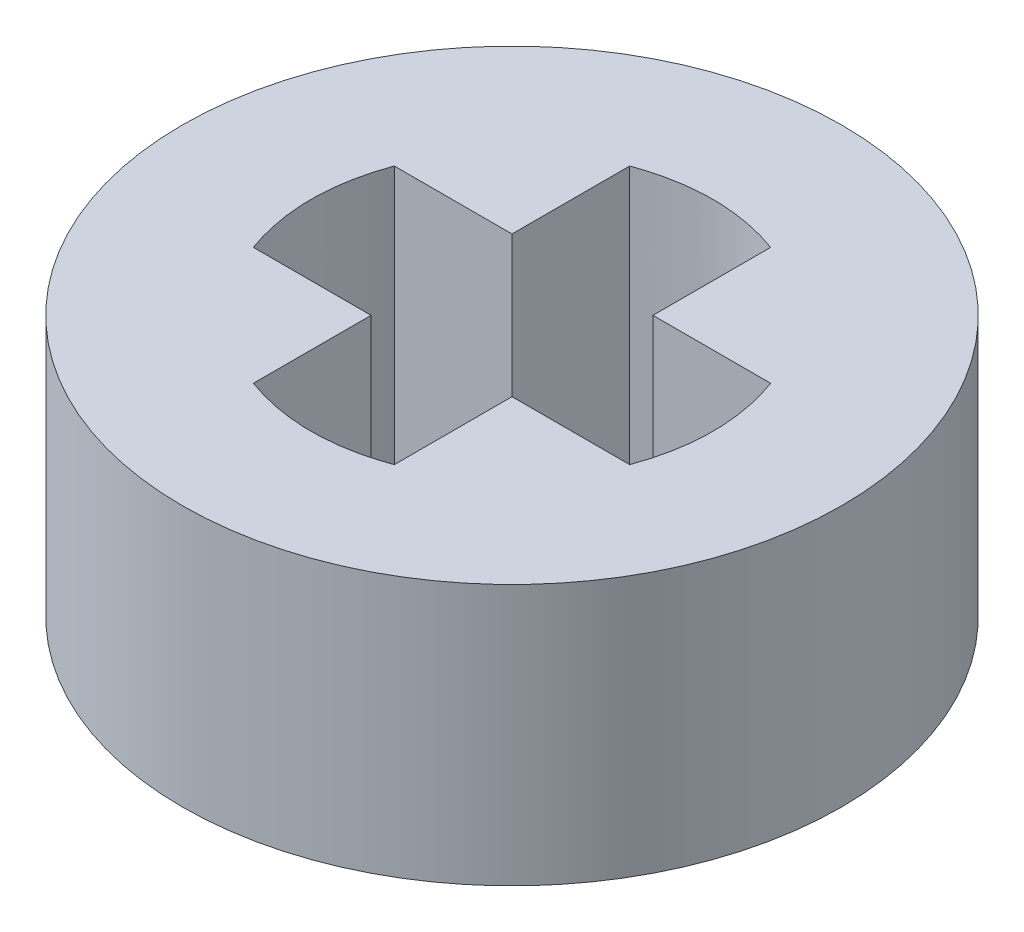
ISO-10303-21;
HEADER;
FILE_DESCRIPTION(('STEP AP214'),'2;1');
FILE_NAME('part.step','',(''),(''),'','','');
FILE_SCHEMA(('AUTOMOTIVE_DESIGN { 1 0 10303 214 1 1 1 1 }'));
ENDSEC;
DATA;
#1=APPLICATION_CONTEXT('core data for automotive mechanical design processes');
#2=APPLICATION_PROTOCOL_DEFINITION('international standard','automotive_design',2000,#1);
#3=PRODUCT_CONTEXT('',#1,'mechanical');
#4=PRODUCT('Part','Part','',(#3));
#5=PRODUCT_RELATED_PRODUCT_CATEGORY('part','',(#4));
#6=PRODUCT_DEFINITION_FORMATION('','',#4);
#7=PRODUCT_DEFINITION_CONTEXT('part definition',#1,'design');
#8=PRODUCT_DEFINITION('design','',#6,#7);
#9=PRODUCT_DEFINITION_SHAPE('','',#8);
#10=(LENGTH_UNIT() NAMED_UNIT(*) SI_UNIT(.MILLI.,.METRE.));
#11=(NAMED_UNIT(*) PLANE_ANGLE_UNIT() SI_UNIT($,.RADIAN.));
#12=(NAMED_UNIT(*) SI_UNIT($,.STERADIAN.) SOLID_ANGLE_UNIT());
#13=UNCERTAINTY_MEASURE_WITH_UNIT(LENGTH_MEASURE(1.E-05),#10,'distance_accuracy_value','');
#14=(GEOMETRIC_REPRESENTATION_CONTEXT(3) GLOBAL_UNCERTAINTY_ASSIGNED_CONTEXT((#13)) GLOBAL_UNIT_ASSIGNED_CONTEXT((#10,
#11,#12)) REPRESENTATION_CONTEXT('',''));
#15=CARTESIAN_POINT('',(0.,0.,0.));
#16=DIRECTION('',(0.,0.,1.));
#17=DIRECTION('',(1.,0.,0.));
#18=AXIS2_PLACEMENT_3D('',#15,#16,#17);
#19=CARTESIAN_POINT('',(0.,3.,0.));
#20=DIRECTION('',(0.,-1.,0.));
#21=DIRECTION('',(0.,0.,-1.));
#22=AXIS2_PLACEMENT_3D('',#19,#20,#21);
#23=CYLINDRICAL_SURFACE('',#22,3.79);
#24=CARTESIAN_POINT('',(0.,3.,0.));
#25=DIRECTION('',(0.,1.,0.));
#26=DIRECTION('',(0.,0.,1.));
#27=AXIS2_PLACEMENT_3D('',#24,#25,#26);
#28=CIRCLE('',#27,3.79);
#29=CARTESIAN_POINT('',(0.,3.,3.79));
#30=VERTEX_POINT('',#29);
#31=EDGE_CURVE('E12',#30,#30,#28,.T.);
#32=ORIENTED_EDGE('',*,*,#31,.F.);
#33=EDGE_LOOP('',(#32));
#34=FACE_BOUND('',#33,.T.);
#35=CARTESIAN_POINT('',(0.,0.,0.));
#36=DIRECTION('',(0.,1.,0.));
#37=DIRECTION('',(0.,0.,1.));
#38=AXIS2_PLACEMENT_3D('',#35,#36,#37);
#39=CIRCLE('',#38,3.79);
#40=CARTESIAN_POINT('',(0.,0.,3.79));
#41=VERTEX_POINT('',#40);
#42=EDGE_CURVE('E41',#41,#41,#39,.T.);
#43=ORIENTED_EDGE('',*,*,#42,.T.);
#44=EDGE_LOOP('',(#43));
#45=FACE_BOUND('',#44,.T.);
#46=ADVANCED_FACE('F38',(#34,#45),#23,.T.);
#47=CARTESIAN_POINT('',(0.,3.,0.));
#48=DIRECTION('',(0.,1.,0.));
#49=DIRECTION('',(0.,0.,1.));
#50=AXIS2_PLACEMENT_3D('',#47,#48,#49);
#51=PLANE('',#50);
#52=CARTESIAN_POINT('',(-2.16333076527839,3.,-0.81));
#53=CARTESIAN_POINT('',(-2.45666923472161,3.,0.));
#54=CARTESIAN_POINT('',(-2.16333076527839,3.,0.81));
#55=B_SPLINE_CURVE_WITH_KNOTS('',2,(#52,#53,#54),.UNSPECIFIED.,.F.,.F.,(3,3),(0.,1.),.UNSPECIFIED.);
#56=CARTESIAN_POINT('',(-2.16333076527839,3.,-0.81));
#57=VERTEX_POINT('',#56);
#58=CARTESIAN_POINT('',(-2.16333076527839,3.,0.81));
#59=VERTEX_POINT('',#58);
#60=EDGE_CURVE('E52',#57,#59,#55,.T.);
#61=ORIENTED_EDGE('',*,*,#60,.F.);
#62=DIRECTION('',(-1.,0.,0.));
#63=VECTOR('',#62,1.);
#64=CARTESIAN_POINT('',(-2.16333076527839,3.,-0.81));
#65=LINE('',#64,#63);
#66=CARTESIAN_POINT('',(-0.81,3.,-0.81));
#67=VERTEX_POINT('',#66);
#68=EDGE_CURVE('E145',#67,#57,#65,.T.);
#69=ORIENTED_EDGE('',*,*,#68,.F.);
#70=DIRECTION('',(0.,0.,1.));
#71=VECTOR('',#70,1.);
#72=CARTESIAN_POINT('',(-0.81,3.,-0.81));
#73=LINE('',#72,#71);
#74=CARTESIAN_POINT('',(-0.81,3.,-2.16333076527839));
#75=VERTEX_POINT('',#74);
#76=EDGE_CURVE('E149',#75,#67,#73,.T.);
#77=ORIENTED_EDGE('',*,*,#76,.F.);
#78=CARTESIAN_POINT('',(0.81,3.,-2.16333076527839));
#79=CARTESIAN_POINT('',(0.,3.,-2.45666923472161));
#80=CARTESIAN_POINT('',(-0.81,3.,-2.16333076527839));
#81=B_SPLINE_CURVE_WITH_KNOTS('',2,(#78,#79,#80),.UNSPECIFIED.,.F.,.F.,(3,3),(0.,1.),.UNSPECIFIED.);
#82=CARTESIAN_POINT('',(0.81,3.,-2.16333076527839));
#83=VERTEX_POINT('',#82);
#84=EDGE_CURVE('E262',#83,#75,#81,.T.);
#85=ORIENTED_EDGE('',*,*,#84,.F.);
#86=DIRECTION('',(0.,0.,-1.));
#87=VECTOR('',#86,1.);
#88=CARTESIAN_POINT('',(0.81,3.,-2.16333076527839));
#89=LINE('',#88,#87);
#90=CARTESIAN_POINT('',(0.81,3.,-0.81));
#91=VERTEX_POINT('',#90);
#92=EDGE_CURVE('E258',#91,#83,#89,.T.);
#93=ORIENTED_EDGE('',*,*,#92,.F.);
#94=DIRECTION('',(-1.,0.,0.));
#95=VECTOR('',#94,1.);
#96=CARTESIAN_POINT('',(0.81,3.,-0.81));
#97=LINE('',#96,#95);
#98=CARTESIAN_POINT('',(2.16333076527839,3.,-0.81));
#99=VERTEX_POINT('',#98);
#100=EDGE_CURVE('E247',#99,#91,#97,.T.);
#101=ORIENTED_EDGE('',*,*,#100,.F.);
#102=CARTESIAN_POINT('',(2.16333076527839,3.,0.81));
#103=CARTESIAN_POINT('',(2.45666923472161,3.,0.));
#104=CARTESIAN_POINT('',(2.16333076527839,3.,-0.81));
#105=B_SPLINE_CURVE_WITH_KNOTS('',2,(#102,#103,#104),.UNSPECIFIED.,.F.,.F.,(3,3),(0.,1.),.UNSPECIFIED.);
#106=CARTESIAN_POINT('',(2.16333076527839,3.,0.81));
#107=VERTEX_POINT('',#106);
#108=EDGE_CURVE('E240',#107,#99,#105,.T.);
#109=ORIENTED_EDGE('',*,*,#108,.F.);
#110=DIRECTION('',(1.,0.,0.));
#111=VECTOR('',#110,1.);
#112=CARTESIAN_POINT('',(2.16333076527839,3.,0.81));
#113=LINE('',#112,#111);
#114=CARTESIAN_POINT('',(0.81,3.,0.81));
#115=VERTEX_POINT('',#114);
#116=EDGE_CURVE('E235',#115,#107,#113,.T.);
#117=ORIENTED_EDGE('',*,*,#116,.F.);
#118=DIRECTION('',(0.,0.,-1.));
#119=VECTOR('',#118,1.);
#120=CARTESIAN_POINT('',(0.81,3.,0.81));
#121=LINE('',#120,#119);
#122=CARTESIAN_POINT('',(0.81,3.,2.16333076527839));
#123=VERTEX_POINT('',#122);
#124=EDGE_CURVE('E217',#123,#115,#121,.T.);
#125=ORIENTED_EDGE('',*,*,#124,.F.);
#126=CARTESIAN_POINT('',(-0.81,3.,2.16333076527839));
#127=CARTESIAN_POINT('',(0.,3.,2.45666923472161));
#128=CARTESIAN_POINT('',(0.81,3.,2.16333076527839));
#129=B_SPLINE_CURVE_WITH_KNOTS('',2,(#126,#127,#128),.UNSPECIFIED.,.F.,.F.,(3,3),(0.,1.),.UNSPECIFIED.);
#130=CARTESIAN_POINT('',(-0.81,3.,2.16333076527839));
#131=VERTEX_POINT('',#130);
#132=EDGE_CURVE('E213',#131,#123,#129,.T.);
#133=ORIENTED_EDGE('',*,*,#132,.F.);
#134=DIRECTION('',(0.,0.,1.));
#135=VECTOR('',#134,1.);
#136=CARTESIAN_POINT('',(-0.81,3.,2.16333076527839));
#137=LINE('',#136,#135);
#138=CARTESIAN_POINT('',(-0.81,3.,0.81));
#139=VERTEX_POINT('',#138);
#140=EDGE_CURVE('E205',#139,#131,#137,.T.);
#141=ORIENTED_EDGE('',*,*,#140,.F.);
#142=DIRECTION('',(1.,0.,0.));
#143=VECTOR('',#142,1.);
#144=CARTESIAN_POINT('',(-0.81,3.,0.81));
#145=LINE('',#144,#143);
#146=EDGE_CURVE('E207',#59,#139,#145,.T.);
#147=ORIENTED_EDGE('',*,*,#146,.F.);
#148=EDGE_LOOP('',(#61,#69,#77,#85,#93,#101,#109,#117,#125,#133,#141,#147));
#149=FACE_BOUND('',#148,.T.);
#150=ORIENTED_EDGE('',*,*,#31,.T.);
#151=EDGE_LOOP('',(#150));
#152=FACE_BOUND('',#151,.T.);
#153=ADVANCED_FACE('F164',(#149,#152),#51,.T.);
#154=CARTESIAN_POINT('',(0.,0.,0.));
#155=DIRECTION('',(0.,1.,0.));
#156=DIRECTION('',(0.,0.,1.));
#157=AXIS2_PLACEMENT_3D('',#154,#155,#156);
#158=PLANE('',#157);
#159=DIRECTION('',(-1.,0.,0.));
#160=VECTOR('',#159,1.);
#161=CARTESIAN_POINT('',(-2.16333076527839,0.,-0.81));
#162=LINE('',#161,#160);
#163=CARTESIAN_POINT('',(-0.81,0.,-0.81));
#164=VERTEX_POINT('',#163);
#165=CARTESIAN_POINT('',(-2.16333076527839,0.,-0.81));
#166=VERTEX_POINT('',#165);
#167=EDGE_CURVE('E134',#164,#166,#162,.T.);
#168=ORIENTED_EDGE('',*,*,#167,.T.);
#169=CARTESIAN_POINT('',(-2.16333076527839,0.,-0.81));
#170=CARTESIAN_POINT('',(-2.45666923472161,0.,0.));
#171=CARTESIAN_POINT('',(-2.16333076527839,0.,0.81));
#172=B_SPLINE_CURVE_WITH_KNOTS('',2,(#169,#170,#171),.UNSPECIFIED.,.F.,.F.,(3,3),(0.,1.),.UNSPECIFIED.);
#173=CARTESIAN_POINT('',(-2.16333076527839,0.,0.81));
#174=VERTEX_POINT('',#173);
#175=EDGE_CURVE('E128',#166,#174,#172,.T.);
#176=ORIENTED_EDGE('',*,*,#175,.T.);
#177=DIRECTION('',(1.,0.,0.));
#178=VECTOR('',#177,1.);
#179=CARTESIAN_POINT('',(-0.81,0.,0.81));
#180=LINE('',#179,#178);
#181=CARTESIAN_POINT('',(-0.81,0.,0.81));
#182=VERTEX_POINT('',#181);
#183=EDGE_CURVE('E137',#174,#182,#180,.T.);
#184=ORIENTED_EDGE('',*,*,#183,.T.);
#185=DIRECTION('',(0.,0.,1.));
#186=VECTOR('',#185,1.);
#187=CARTESIAN_POINT('',(-0.81,0.,2.16333076527839));
#188=LINE('',#187,#186);
#189=CARTESIAN_POINT('',(-0.81,0.,2.16333076527839));
#190=VERTEX_POINT('',#189);
#191=EDGE_CURVE('E60',#182,#190,#188,.T.);
#192=ORIENTED_EDGE('',*,*,#191,.T.);
#193=CARTESIAN_POINT('',(-0.81,0.,2.16333076527839));
#194=CARTESIAN_POINT('',(0.,0.,2.45666923472161));
#195=CARTESIAN_POINT('',(0.81,0.,2.16333076527839));
#196=B_SPLINE_CURVE_WITH_KNOTS('',2,(#193,#194,#195),.UNSPECIFIED.,.F.,.F.,(3,3),(0.,1.),.UNSPECIFIED.);
#197=CARTESIAN_POINT('',(0.81,0.,2.16333076527839));
#198=VERTEX_POINT('',#197);
#199=EDGE_CURVE('E363',#190,#198,#196,.T.);
#200=ORIENTED_EDGE('',*,*,#199,.T.);
#201=DIRECTION('',(0.,0.,-1.));
#202=VECTOR('',#201,1.);
#203=CARTESIAN_POINT('',(0.81,0.,0.81));
#204=LINE('',#203,#202);
#205=CARTESIAN_POINT('',(0.81,0.,0.81));
#206=VERTEX_POINT('',#205);
#207=EDGE_CURVE('E358',#198,#206,#204,.T.);
#208=ORIENTED_EDGE('',*,*,#207,.T.);
#209=DIRECTION('',(1.,0.,0.));
#210=VECTOR('',#209,1.);
#211=CARTESIAN_POINT('',(2.16333076527839,0.,0.81));
#212=LINE('',#211,#210);
#213=CARTESIAN_POINT('',(2.16333076527839,0.,0.81));
#214=VERTEX_POINT('',#213);
#215=EDGE_CURVE('E328',#206,#214,#212,.T.);
#216=ORIENTED_EDGE('',*,*,#215,.T.);
#217=CARTESIAN_POINT('',(2.16333076527839,0.,0.81));
#218=CARTESIAN_POINT('',(2.45666923472161,0.,0.));
#219=CARTESIAN_POINT('',(2.16333076527839,0.,-0.81));
#220=B_SPLINE_CURVE_WITH_KNOTS('',2,(#217,#218,#219),.UNSPECIFIED.,.F.,.F.,(3,3),(0.,1.),.UNSPECIFIED.);
#221=CARTESIAN_POINT('',(2.16333076527839,0.,-0.81));
#222=VERTEX_POINT('',#221);
#223=EDGE_CURVE('E321',#214,#222,#220,.T.);
#224=ORIENTED_EDGE('',*,*,#223,.T.);
#225=DIRECTION('',(-1.,0.,0.));
#226=VECTOR('',#225,1.);
#227=CARTESIAN_POINT('',(0.81,0.,-0.81));
#228=LINE('',#227,#226);
#229=CARTESIAN_POINT('',(0.81,0.,-0.81));
#230=VERTEX_POINT('',#229);
#231=EDGE_CURVE('E327',#222,#230,#228,.T.);
#232=ORIENTED_EDGE('',*,*,#231,.T.);
#233=DIRECTION('',(0.,0.,-1.));
#234=VECTOR('',#233,1.);
#235=CARTESIAN_POINT('',(0.81,0.,-2.16333076527839));
#236=LINE('',#235,#234);
#237=CARTESIAN_POINT('',(0.81,0.,-2.16333076527839));
#238=VERTEX_POINT('',#237);
#239=EDGE_CURVE('E293',#230,#238,#236,.T.);
#240=ORIENTED_EDGE('',*,*,#239,.T.);
#241=CARTESIAN_POINT('',(0.81,0.,-2.16333076527839));
#242=CARTESIAN_POINT('',(0.,0.,-2.45666923472161));
#243=CARTESIAN_POINT('',(-0.81,0.,-2.16333076527839));
#244=B_SPLINE_CURVE_WITH_KNOTS('',2,(#241,#242,#243),.UNSPECIFIED.,.F.,.F.,(3,3),(0.,1.),.UNSPECIFIED.);
#245=CARTESIAN_POINT('',(-0.81,0.,-2.16333076527839));
#246=VERTEX_POINT('',#245);
#247=EDGE_CURVE('E287',#238,#246,#244,.T.);
#248=ORIENTED_EDGE('',*,*,#247,.T.);
#249=DIRECTION('',(0.,0.,1.));
#250=VECTOR('',#249,1.);
#251=CARTESIAN_POINT('',(-0.81,0.,-0.81));
#252=LINE('',#251,#250);
#253=EDGE_CURVE('E285',#246,#164,#252,.T.);
#254=ORIENTED_EDGE('',*,*,#253,.T.);
#255=EDGE_LOOP('',(#168,#176,#184,#192,#200,#208,#216,#224,#232,#240,#248,#254));
#256=FACE_BOUND('',#255,.T.);
#257=ORIENTED_EDGE('',*,*,#42,.F.);
#258=EDGE_LOOP('',(#257));
#259=FACE_BOUND('',#258,.T.);
#260=ADVANCED_FACE('F141',(#256,#259),#158,.F.);
#261=DIRECTION('',(0.,1.,0.));
#262=VECTOR('',#261,1.);
#263=SURFACE_OF_LINEAR_EXTRUSION('',#172,#262);
#264=ORIENTED_EDGE('',*,*,#60,.T.);
#265=DIRECTION('',(0.,1.,0.));
#266=VECTOR('',#265,1.);
#267=CARTESIAN_POINT('',(-2.16333076527839,0.,0.81));
#268=LINE('',#267,#266);
#269=EDGE_CURVE('E124',#174,#59,#268,.T.);
#270=ORIENTED_EDGE('',*,*,#269,.F.);
#271=ORIENTED_EDGE('',*,*,#175,.F.);
#272=DIRECTION('',(0.,1.,0.));
#273=VECTOR('',#272,1.);
#274=CARTESIAN_POINT('',(-2.16333076527839,0.,-0.81));
#275=LINE('',#274,#273);
#276=EDGE_CURVE('E178',#166,#57,#275,.T.);
#277=ORIENTED_EDGE('',*,*,#276,.T.);
#278=EDGE_LOOP('',(#264,#270,#271,#277));
#279=FACE_BOUND('',#278,.T.);
#280=ADVANCED_FACE('F126',(#279),#263,.F.);
#281=CARTESIAN_POINT('',(-2.16333076527839,0.,-0.81));
#282=DIRECTION('',(0.,0.,-1.));
#283=DIRECTION('',(-1.,0.,0.));
#284=AXIS2_PLACEMENT_3D('',#281,#282,#283);
#285=PLANE('',#284);
#286=ORIENTED_EDGE('',*,*,#68,.T.);
#287=ORIENTED_EDGE('',*,*,#276,.F.);
#288=ORIENTED_EDGE('',*,*,#167,.F.);
#289=DIRECTION('',(0.,1.,0.));
#290=VECTOR('',#289,1.);
#291=CARTESIAN_POINT('',(-0.81,0.,-0.81));
#292=LINE('',#291,#290);
#293=EDGE_CURVE('E179',#164,#67,#292,.T.);
#294=ORIENTED_EDGE('',*,*,#293,.T.);
#295=EDGE_LOOP('',(#286,#287,#288,#294));
#296=FACE_BOUND('',#295,.T.);
#297=ADVANCED_FACE('F162',(#296),#285,.F.);
#298=CARTESIAN_POINT('',(-0.81,0.,-0.81));
#299=DIRECTION('',(-1.,0.,0.));
#300=DIRECTION('',(0.,0.,1.));
#301=AXIS2_PLACEMENT_3D('',#298,#299,#300);
#302=PLANE('',#301);
#303=ORIENTED_EDGE('',*,*,#76,.T.);
#304=ORIENTED_EDGE('',*,*,#293,.F.);
#305=ORIENTED_EDGE('',*,*,#253,.F.);
#306=DIRECTION('',(0.,1.,0.));
#307=VECTOR('',#306,1.);
#308=CARTESIAN_POINT('',(-0.81,0.,-2.16333076527839));
#309=LINE('',#308,#307);
#310=EDGE_CURVE('E181',#246,#75,#309,.T.);
#311=ORIENTED_EDGE('',*,*,#310,.T.);
#312=EDGE_LOOP('',(#303,#304,#305,#311));
#313=FACE_BOUND('',#312,.T.);
#314=ADVANCED_FACE('F304',(#313),#302,.F.);
#315=DIRECTION('',(0.,1.,0.));
#316=VECTOR('',#315,1.);
#317=SURFACE_OF_LINEAR_EXTRUSION('',#244,#316);
#318=ORIENTED_EDGE('',*,*,#84,.T.);
#319=ORIENTED_EDGE('',*,*,#310,.F.);
#320=ORIENTED_EDGE('',*,*,#247,.F.);
#321=DIRECTION('',(0.,1.,0.));
#322=VECTOR('',#321,1.);
#323=CARTESIAN_POINT('',(0.81,0.,-2.16333076527839));
#324=LINE('',#323,#322);
#325=EDGE_CURVE('E187',#238,#83,#324,.T.);
#326=ORIENTED_EDGE('',*,*,#325,.T.);
#327=EDGE_LOOP('',(#318,#319,#320,#326));
#328=FACE_BOUND('',#327,.T.);
#329=ADVANCED_FACE('F299',(#328),#317,.F.);
#330=CARTESIAN_POINT('',(0.81,0.,-2.16333076527839));
#331=DIRECTION('',(1.,0.,0.));
#332=DIRECTION('',(0.,0.,-1.));
#333=AXIS2_PLACEMENT_3D('',#330,#331,#332);
#334=PLANE('',#333);
#335=ORIENTED_EDGE('',*,*,#92,.T.);
#336=ORIENTED_EDGE('',*,*,#325,.F.);
#337=ORIENTED_EDGE('',*,*,#239,.F.);
#338=DIRECTION('',(0.,1.,0.));
#339=VECTOR('',#338,1.);
#340=CARTESIAN_POINT('',(0.81,0.,-0.81));
#341=LINE('',#340,#339);
#342=EDGE_CURVE('E189',#230,#91,#341,.T.);
#343=ORIENTED_EDGE('',*,*,#342,.T.);
#344=EDGE_LOOP('',(#335,#336,#337,#343));
#345=FACE_BOUND('',#344,.T.);
#346=ADVANCED_FACE('F303',(#345),#334,.F.);
#347=CARTESIAN_POINT('',(0.81,0.,-0.81));
#348=DIRECTION('',(0.,0.,-1.));
#349=DIRECTION('',(-1.,0.,0.));
#350=AXIS2_PLACEMENT_3D('',#347,#348,#349);
#351=PLANE('',#350);
#352=ORIENTED_EDGE('',*,*,#100,.T.);
#353=ORIENTED_EDGE('',*,*,#342,.F.);
#354=ORIENTED_EDGE('',*,*,#231,.F.);
#355=DIRECTION('',(0.,1.,0.));
#356=VECTOR('',#355,1.);
#357=CARTESIAN_POINT('',(2.16333076527839,0.,-0.81));
#358=LINE('',#357,#356);
#359=EDGE_CURVE('E191',#222,#99,#358,.T.);
#360=ORIENTED_EDGE('',*,*,#359,.T.);
#361=EDGE_LOOP('',(#352,#353,#354,#360));
#362=FACE_BOUND('',#361,.T.);
#363=ADVANCED_FACE('F309',(#362),#351,.F.);
#364=DIRECTION('',(0.,1.,0.));
#365=VECTOR('',#364,1.);
#366=SURFACE_OF_LINEAR_EXTRUSION('',#220,#365);
#367=ORIENTED_EDGE('',*,*,#108,.T.);
#368=ORIENTED_EDGE('',*,*,#359,.F.);
#369=ORIENTED_EDGE('',*,*,#223,.F.);
#370=DIRECTION('',(0.,1.,0.));
#371=VECTOR('',#370,1.);
#372=CARTESIAN_POINT('',(2.16333076527839,0.,0.81));
#373=LINE('',#372,#371);
#374=EDGE_CURVE('E193',#214,#107,#373,.T.);
#375=ORIENTED_EDGE('',*,*,#374,.T.);
#376=EDGE_LOOP('',(#367,#368,#369,#375));
#377=FACE_BOUND('',#376,.T.);
#378=ADVANCED_FACE('F313',(#377),#366,.F.);
#379=CARTESIAN_POINT('',(2.16333076527839,0.,0.81));
#380=DIRECTION('',(0.,0.,1.));
#381=DIRECTION('',(1.,0.,0.));
#382=AXIS2_PLACEMENT_3D('',#379,#380,#381);
#383=PLANE('',#382);
#384=ORIENTED_EDGE('',*,*,#116,.T.);
#385=ORIENTED_EDGE('',*,*,#374,.F.);
#386=ORIENTED_EDGE('',*,*,#215,.F.);
#387=DIRECTION('',(0.,1.,0.));
#388=VECTOR('',#387,1.);
#389=CARTESIAN_POINT('',(0.81,0.,0.81));
#390=LINE('',#389,#388);
#391=EDGE_CURVE('E195',#206,#115,#390,.T.);
#392=ORIENTED_EDGE('',*,*,#391,.T.);
#393=EDGE_LOOP('',(#384,#385,#386,#392));
#394=FACE_BOUND('',#393,.T.);
#395=ADVANCED_FACE('F318',(#394),#383,.F.);
#396=CARTESIAN_POINT('',(0.81,0.,0.81));
#397=DIRECTION('',(1.,0.,0.));
#398=DIRECTION('',(0.,0.,-1.));
#399=AXIS2_PLACEMENT_3D('',#396,#397,#398);
#400=PLANE('',#399);
#401=ORIENTED_EDGE('',*,*,#124,.T.);
#402=ORIENTED_EDGE('',*,*,#391,.F.);
#403=ORIENTED_EDGE('',*,*,#207,.F.);
#404=DIRECTION('',(0.,1.,0.));
#405=VECTOR('',#404,1.);
#406=CARTESIAN_POINT('',(0.81,0.,2.16333076527839));
#407=LINE('',#406,#405);
#408=EDGE_CURVE('E197',#198,#123,#407,.T.);
#409=ORIENTED_EDGE('',*,*,#408,.T.);
#410=EDGE_LOOP('',(#401,#402,#403,#409));
#411=FACE_BOUND('',#410,.T.);
#412=ADVANCED_FACE('F355',(#411),#400,.F.);
#413=DIRECTION('',(0.,1.,0.));
#414=VECTOR('',#413,1.);
#415=SURFACE_OF_LINEAR_EXTRUSION('',#196,#414);
#416=ORIENTED_EDGE('',*,*,#132,.T.);
#417=ORIENTED_EDGE('',*,*,#408,.F.);
#418=ORIENTED_EDGE('',*,*,#199,.F.);
#419=DIRECTION('',(0.,1.,0.));
#420=VECTOR('',#419,1.);
#421=CARTESIAN_POINT('',(-0.81,0.,2.16333076527839));
#422=LINE('',#421,#420);
#423=EDGE_CURVE('E199',#190,#131,#422,.T.);
#424=ORIENTED_EDGE('',*,*,#423,.T.);
#425=EDGE_LOOP('',(#416,#417,#418,#424));
#426=FACE_BOUND('',#425,.T.);
#427=ADVANCED_FACE('F362',(#426),#415,.F.);
#428=CARTESIAN_POINT('',(-0.81,0.,2.16333076527839));
#429=DIRECTION('',(-1.,0.,0.));
#430=DIRECTION('',(0.,0.,1.));
#431=AXIS2_PLACEMENT_3D('',#428,#429,#430);
#432=PLANE('',#431);
#433=ORIENTED_EDGE('',*,*,#140,.T.);
#434=ORIENTED_EDGE('',*,*,#423,.F.);
#435=ORIENTED_EDGE('',*,*,#191,.F.);
#436=DIRECTION('',(0.,1.,0.));
#437=VECTOR('',#436,1.);
#438=CARTESIAN_POINT('',(-0.81,0.,0.81));
#439=LINE('',#438,#437);
#440=EDGE_CURVE('E133',#182,#139,#439,.T.);
#441=ORIENTED_EDGE('',*,*,#440,.T.);
#442=EDGE_LOOP('',(#433,#434,#435,#441));
#443=FACE_BOUND('',#442,.T.);
#444=ADVANCED_FACE('F203',(#443),#432,.F.);
#445=CARTESIAN_POINT('',(-0.81,0.,0.81));
#446=DIRECTION('',(0.,0.,1.));
#447=DIRECTION('',(1.,0.,0.));
#448=AXIS2_PLACEMENT_3D('',#445,#446,#447);
#449=PLANE('',#448);
#450=ORIENTED_EDGE('',*,*,#146,.T.);
#451=ORIENTED_EDGE('',*,*,#440,.F.);
#452=ORIENTED_EDGE('',*,*,#183,.F.);
#453=ORIENTED_EDGE('',*,*,#269,.T.);
#454=EDGE_LOOP('',(#450,#451,#452,#453));
#455=FACE_BOUND('',#454,.T.);
#456=ADVANCED_FACE('F138',(#455),#449,.F.);
#457=CLOSED_SHELL('',(#46,#153,#260,#280,#297,#314,#329,#346,#363,#378,#395,#412,#427,#444,#456));
#458=MANIFOLD_SOLID_BREP('B2',#457);
#459=ADVANCED_BREP_SHAPE_REPRESENTATION('',(#18,#458),#14);
#460=SHAPE_DEFINITION_REPRESENTATION(#9,#459);
ENDSEC;
END-ISO-10303-21;
